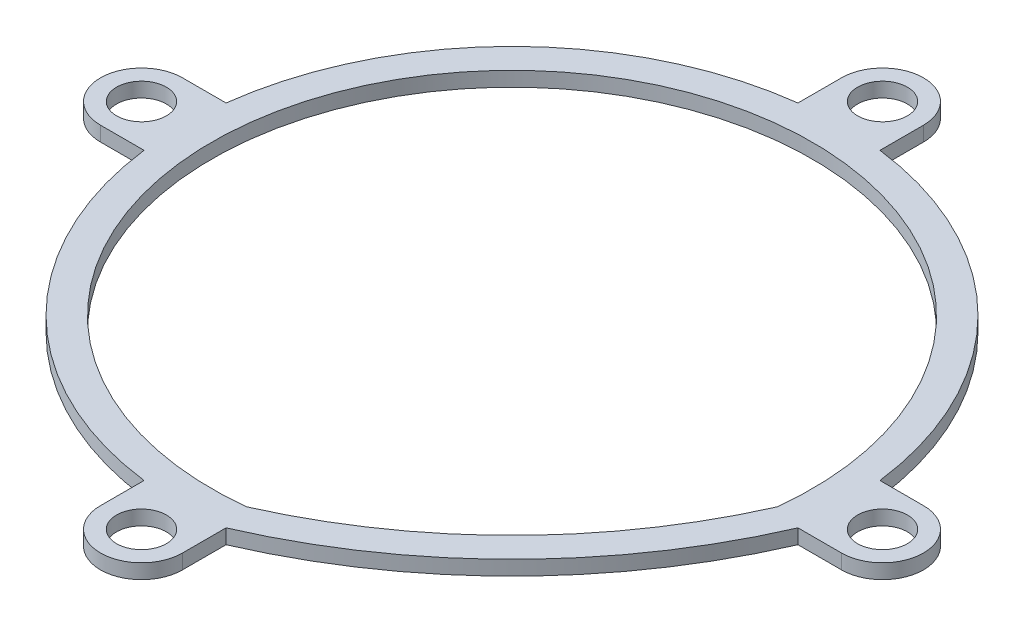
ISO-10303-21;
HEADER;
FILE_DESCRIPTION(('STEP AP214'),'2;1');
FILE_NAME('part.step','',(''),(''),'','','');
FILE_SCHEMA(('AUTOMOTIVE_DESIGN { 1 0 10303 214 1 1 1 1 }'));
ENDSEC;
DATA;
#1=APPLICATION_CONTEXT('core data for automotive mechanical design processes');
#2=APPLICATION_PROTOCOL_DEFINITION('international standard','automotive_design',2000,#1);
#3=PRODUCT_CONTEXT('',#1,'mechanical');
#4=PRODUCT('Part','Part','',(#3));
#5=PRODUCT_RELATED_PRODUCT_CATEGORY('part','',(#4));
#6=PRODUCT_DEFINITION_FORMATION('','',#4);
#7=PRODUCT_DEFINITION_CONTEXT('part definition',#1,'design');
#8=PRODUCT_DEFINITION('design','',#6,#7);
#9=PRODUCT_DEFINITION_SHAPE('','',#8);
#10=(LENGTH_UNIT() NAMED_UNIT(*) SI_UNIT(.MILLI.,.METRE.));
#11=(NAMED_UNIT(*) PLANE_ANGLE_UNIT() SI_UNIT($,.RADIAN.));
#12=(NAMED_UNIT(*) SI_UNIT($,.STERADIAN.) SOLID_ANGLE_UNIT());
#13=UNCERTAINTY_MEASURE_WITH_UNIT(LENGTH_MEASURE(1.E-05),#10,'distance_accuracy_value','');
#14=(GEOMETRIC_REPRESENTATION_CONTEXT(3) GLOBAL_UNCERTAINTY_ASSIGNED_CONTEXT((#13)) GLOBAL_UNIT_ASSIGNED_CONTEXT((#10,
#11,#12)) REPRESENTATION_CONTEXT('',''));
#15=CARTESIAN_POINT('',(0.,0.,0.));
#16=DIRECTION('',(0.,0.,1.));
#17=DIRECTION('',(1.,0.,0.));
#18=AXIS2_PLACEMENT_3D('',#15,#16,#17);
#19=CARTESIAN_POINT('',(-12.1017663344302,1.,-12.10176633443));
#20=DIRECTION('',(0.,1.,0.));
#21=DIRECTION('',(0.,0.,1.));
#22=AXIS2_PLACEMENT_3D('',#19,#20,#21);
#23=PLANE('',#22);
#24=CARTESIAN_POINT('',(-25.3,1.,0.));
#25=DIRECTION('',(0.,1.,0.));
#26=DIRECTION('',(0.,0.,1.));
#27=AXIS2_PLACEMENT_3D('',#24,#25,#26);
#28=CIRCLE('',#27,1.7);
#29=CARTESIAN_POINT('',(-25.3,1.,1.70000000000009));
#30=VERTEX_POINT('',#29);
#31=EDGE_CURVE('E583',#30,#30,#28,.T.);
#32=ORIENTED_EDGE('',*,*,#31,.F.);
#33=EDGE_LOOP('',(#32));
#34=FACE_BOUND('',#33,.T.);
#35=CARTESIAN_POINT('',(0.,1.,-25.3));
#36=DIRECTION('',(0.,1.,0.));
#37=DIRECTION('',(0.,0.,1.));
#38=AXIS2_PLACEMENT_3D('',#35,#36,#37);
#39=CIRCLE('',#38,1.7);
#40=CARTESIAN_POINT('',(0.,1.,-23.6));
#41=VERTEX_POINT('',#40);
#42=EDGE_CURVE('E585',#41,#41,#39,.T.);
#43=ORIENTED_EDGE('',*,*,#42,.F.);
#44=EDGE_LOOP('',(#43));
#45=FACE_BOUND('',#44,.T.);
#46=CARTESIAN_POINT('',(25.3,1.,-2.65412691824451E-13));
#47=DIRECTION('',(0.,1.,0.));
#48=DIRECTION('',(0.,0.,1.));
#49=AXIS2_PLACEMENT_3D('',#46,#47,#48);
#50=CIRCLE('',#49,1.7);
#51=CARTESIAN_POINT('',(25.3,1.,1.69999999999973));
#52=VERTEX_POINT('',#51);
#53=EDGE_CURVE('E593',#52,#52,#50,.T.);
#54=ORIENTED_EDGE('',*,*,#53,.F.);
#55=EDGE_LOOP('',(#54));
#56=FACE_BOUND('',#55,.T.);
#57=CARTESIAN_POINT('',(1.80411241501588E-13,1.,25.3));
#58=DIRECTION('',(0.,1.,0.));
#59=DIRECTION('',(0.,0.,1.));
#60=AXIS2_PLACEMENT_3D('',#57,#58,#59);
#61=CIRCLE('',#60,1.7);
#62=CARTESIAN_POINT('',(1.80411241501588E-13,1.,27.));
#63=VERTEX_POINT('',#62);
#64=EDGE_CURVE('E598',#63,#63,#61,.T.);
#65=ORIENTED_EDGE('',*,*,#64,.F.);
#66=EDGE_LOOP('',(#65));
#67=FACE_BOUND('',#66,.T.);
#68=CARTESIAN_POINT('',(-12.1017663344302,1.,-12.10176633443));
#69=DIRECTION('',(0.,1.,0.));
#70=DIRECTION('',(0.,0.,1.));
#71=AXIS2_PLACEMENT_3D('',#68,#69,#70);
#72=CIRCLE('',#71,37.513619216132);
#73=CARTESIAN_POINT('',(2.80000000000016,1.,22.3250979841075));
#74=VERTEX_POINT('',#73);
#75=CARTESIAN_POINT('',(22.3250979841075,1.,2.79999999999975));
#76=VERTEX_POINT('',#75);
#77=EDGE_CURVE('E180',#74,#76,#72,.T.);
#78=ORIENTED_EDGE('',*,*,#77,.T.);
#79=DIRECTION('',(1.,0.,0.));
#80=VECTOR('',#79,1.);
#81=CARTESIAN_POINT('',(22.3250979841075,1.,2.79999999999975));
#82=LINE('',#81,#80);
#83=CARTESIAN_POINT('',(25.3,1.,2.79999999999973));
#84=VERTEX_POINT('',#83);
#85=EDGE_CURVE('E183',#76,#84,#82,.T.);
#86=ORIENTED_EDGE('',*,*,#85,.T.);
#87=CARTESIAN_POINT('',(25.3,1.,-2.65412691824451E-13));
#88=DIRECTION('',(0.,1.,0.));
#89=DIRECTION('',(0.,0.,1.));
#90=AXIS2_PLACEMENT_3D('',#87,#88,#89);
#91=CIRCLE('',#90,2.8);
#92=CARTESIAN_POINT('',(25.3,1.,-2.80000000000026));
#93=VERTEX_POINT('',#92);
#94=EDGE_CURVE('E186',#84,#93,#91,.T.);
#95=ORIENTED_EDGE('',*,*,#94,.T.);
#96=DIRECTION('',(-1.,0.,0.));
#97=VECTOR('',#96,1.);
#98=CARTESIAN_POINT('',(25.3,1.,-2.80000000000026));
#99=LINE('',#98,#97);
#100=CARTESIAN_POINT('',(22.3250979841075,1.,-2.80000000000023));
#101=VERTEX_POINT('',#100);
#102=EDGE_CURVE('E188',#93,#101,#99,.T.);
#103=ORIENTED_EDGE('',*,*,#102,.T.);
#104=CARTESIAN_POINT('',(0.,1.,0.));
#105=DIRECTION('',(0.,1.,0.));
#106=DIRECTION('',(0.,0.,1.));
#107=AXIS2_PLACEMENT_3D('',#104,#105,#106);
#108=CIRCLE('',#107,22.5);
#109=CARTESIAN_POINT('',(2.8,1.,-22.3250979841075));
#110=VERTEX_POINT('',#109);
#111=EDGE_CURVE('E190',#101,#110,#108,.T.);
#112=ORIENTED_EDGE('',*,*,#111,.T.);
#113=DIRECTION('',(0.,0.,-1.));
#114=VECTOR('',#113,1.);
#115=CARTESIAN_POINT('',(2.8,1.,-22.3250979841075));
#116=LINE('',#115,#114);
#117=CARTESIAN_POINT('',(2.8,1.,-25.3));
#118=VERTEX_POINT('',#117);
#119=EDGE_CURVE('E192',#110,#118,#116,.T.);
#120=ORIENTED_EDGE('',*,*,#119,.T.);
#121=CARTESIAN_POINT('',(0.,1.,-25.3));
#122=DIRECTION('',(0.,1.,0.));
#123=DIRECTION('',(0.,0.,1.));
#124=AXIS2_PLACEMENT_3D('',#121,#122,#123);
#125=CIRCLE('',#124,2.8);
#126=CARTESIAN_POINT('',(-2.8,1.,-25.3));
#127=VERTEX_POINT('',#126);
#128=EDGE_CURVE('E194',#118,#127,#125,.T.);
#129=ORIENTED_EDGE('',*,*,#128,.T.);
#130=DIRECTION('',(0.,0.,1.));
#131=VECTOR('',#130,1.);
#132=CARTESIAN_POINT('',(-2.8,1.,-25.3));
#133=LINE('',#132,#131);
#134=CARTESIAN_POINT('',(-2.79999999999999,1.,-22.3250979841075));
#135=VERTEX_POINT('',#134);
#136=EDGE_CURVE('E196',#127,#135,#133,.T.);
#137=ORIENTED_EDGE('',*,*,#136,.T.);
#138=CARTESIAN_POINT('',(0.,1.,0.));
#139=DIRECTION('',(0.,1.,0.));
#140=DIRECTION('',(0.,0.,1.));
#141=AXIS2_PLACEMENT_3D('',#138,#139,#140);
#142=CIRCLE('',#141,22.5);
#143=CARTESIAN_POINT('',(-22.3250979841075,1.,-2.79999999999993));
#144=VERTEX_POINT('',#143);
#145=EDGE_CURVE('E198',#135,#144,#142,.T.);
#146=ORIENTED_EDGE('',*,*,#145,.T.);
#147=DIRECTION('',(-1.,0.,0.));
#148=VECTOR('',#147,1.);
#149=CARTESIAN_POINT('',(-22.3250979841075,1.,-2.79999999999993));
#150=LINE('',#149,#148);
#151=CARTESIAN_POINT('',(-25.3,1.,-2.79999999999991));
#152=VERTEX_POINT('',#151);
#153=EDGE_CURVE('E200',#144,#152,#150,.T.);
#154=ORIENTED_EDGE('',*,*,#153,.T.);
#155=CARTESIAN_POINT('',(-25.3,1.,0.));
#156=DIRECTION('',(0.,1.,0.));
#157=DIRECTION('',(0.,0.,1.));
#158=AXIS2_PLACEMENT_3D('',#155,#156,#157);
#159=CIRCLE('',#158,2.8);
#160=CARTESIAN_POINT('',(-25.3,1.,2.80000000000008));
#161=VERTEX_POINT('',#160);
#162=EDGE_CURVE('E202',#152,#161,#159,.T.);
#163=ORIENTED_EDGE('',*,*,#162,.T.);
#164=DIRECTION('',(1.,0.,0.));
#165=VECTOR('',#164,1.);
#166=CARTESIAN_POINT('',(-25.3,1.,2.80000000000008));
#167=LINE('',#166,#165);
#168=CARTESIAN_POINT('',(-22.3250979841075,1.,2.80000000000007));
#169=VERTEX_POINT('',#168);
#170=EDGE_CURVE('E204',#161,#169,#167,.T.);
#171=ORIENTED_EDGE('',*,*,#170,.T.);
#172=CARTESIAN_POINT('',(0.,1.,0.));
#173=DIRECTION('',(0.,1.,0.));
#174=DIRECTION('',(0.,0.,1.));
#175=AXIS2_PLACEMENT_3D('',#172,#173,#174);
#176=CIRCLE('',#175,22.5);
#177=CARTESIAN_POINT('',(-2.79999999999984,1.,22.3250979841075));
#178=VERTEX_POINT('',#177);
#179=EDGE_CURVE('E206',#169,#178,#176,.T.);
#180=ORIENTED_EDGE('',*,*,#179,.T.);
#181=DIRECTION('',(0.,0.,1.));
#182=VECTOR('',#181,1.);
#183=CARTESIAN_POINT('',(-2.79999999999984,1.,22.3250979841075));
#184=LINE('',#183,#182);
#185=CARTESIAN_POINT('',(-2.79999999999982,1.,25.3));
#186=VERTEX_POINT('',#185);
#187=EDGE_CURVE('E208',#178,#186,#184,.T.);
#188=ORIENTED_EDGE('',*,*,#187,.T.);
#189=CARTESIAN_POINT('',(1.80411241501588E-13,1.,25.3));
#190=DIRECTION('',(0.,1.,0.));
#191=DIRECTION('',(0.,0.,1.));
#192=AXIS2_PLACEMENT_3D('',#189,#190,#191);
#193=CIRCLE('',#192,2.8);
#194=CARTESIAN_POINT('',(2.80000000000018,1.,25.3));
#195=VERTEX_POINT('',#194);
#196=EDGE_CURVE('E210',#186,#195,#193,.T.);
#197=ORIENTED_EDGE('',*,*,#196,.T.);
#198=DIRECTION('',(0.,0.,-1.));
#199=VECTOR('',#198,1.);
#200=CARTESIAN_POINT('',(2.80000000000018,1.,25.3));
#201=LINE('',#200,#199);
#202=EDGE_CURVE('E212',#195,#74,#201,.T.);
#203=ORIENTED_EDGE('',*,*,#202,.T.);
#204=EDGE_LOOP('',(#78,#86,#95,#103,#112,#120,#129,#137,#146,#154,#163,#171,#180,#188,#197,#203));
#205=FACE_BOUND('',#204,.T.);
#206=CARTESIAN_POINT('',(0.,1.,0.));
#207=DIRECTION('',(0.,1.,0.));
#208=DIRECTION('',(0.,0.,1.));
#209=AXIS2_PLACEMENT_3D('',#206,#207,#208);
#210=CIRCLE('',#209,20.5);
#211=CARTESIAN_POINT('',(20.373939602323,1.,2.26993063349802));
#212=VERTEX_POINT('',#211);
#213=CARTESIAN_POINT('',(2.26993063349836,1.,20.373939602323));
#214=VERTEX_POINT('',#213);
#215=EDGE_CURVE('E160',#212,#214,#210,.T.);
#216=ORIENTED_EDGE('',*,*,#215,.F.);
#217=CARTESIAN_POINT('',(-12.1017663344302,1.,-12.10176633443));
#218=DIRECTION('',(0.,1.,0.));
#219=DIRECTION('',(0.,0.,1.));
#220=AXIS2_PLACEMENT_3D('',#217,#218,#219);
#221=CIRCLE('',#220,35.513619216132);
#222=EDGE_CURVE('E166',#214,#212,#221,.T.);
#223=ORIENTED_EDGE('',*,*,#222,.F.);
#224=EDGE_LOOP('',(#216,#223));
#225=FACE_BOUND('',#224,.T.);
#226=ADVANCED_FACE('F36',(#34,#45,#56,#67,#205,#225),#23,.T.);
#227=CARTESIAN_POINT('',(-12.1017663344302,0.,-12.10176633443));
#228=DIRECTION('',(0.,1.,0.));
#229=DIRECTION('',(0.,0.,1.));
#230=AXIS2_PLACEMENT_3D('',#227,#228,#229);
#231=PLANE('',#230);
#232=CARTESIAN_POINT('',(-25.3,0.,0.));
#233=DIRECTION('',(0.,1.,0.));
#234=DIRECTION('',(0.,0.,1.));
#235=AXIS2_PLACEMENT_3D('',#232,#233,#234);
#236=CIRCLE('',#235,1.7);
#237=CARTESIAN_POINT('',(-25.3,0.,1.70000000000009));
#238=VERTEX_POINT('',#237);
#239=EDGE_CURVE('E581',#238,#238,#236,.T.);
#240=ORIENTED_EDGE('',*,*,#239,.T.);
#241=EDGE_LOOP('',(#240));
#242=FACE_BOUND('',#241,.T.);
#243=CARTESIAN_POINT('',(0.,0.,-25.3));
#244=DIRECTION('',(0.,1.,0.));
#245=DIRECTION('',(0.,0.,1.));
#246=AXIS2_PLACEMENT_3D('',#243,#244,#245);
#247=CIRCLE('',#246,1.7);
#248=CARTESIAN_POINT('',(0.,0.,-23.6));
#249=VERTEX_POINT('',#248);
#250=EDGE_CURVE('E590',#249,#249,#247,.T.);
#251=ORIENTED_EDGE('',*,*,#250,.T.);
#252=EDGE_LOOP('',(#251));
#253=FACE_BOUND('',#252,.T.);
#254=CARTESIAN_POINT('',(25.3,0.,-2.65412691824451E-13));
#255=DIRECTION('',(0.,1.,0.));
#256=DIRECTION('',(0.,0.,1.));
#257=AXIS2_PLACEMENT_3D('',#254,#255,#256);
#258=CIRCLE('',#257,1.7);
#259=CARTESIAN_POINT('',(25.3,0.,1.69999999999973));
#260=VERTEX_POINT('',#259);
#261=EDGE_CURVE('E596',#260,#260,#258,.T.);
#262=ORIENTED_EDGE('',*,*,#261,.T.);
#263=EDGE_LOOP('',(#262));
#264=FACE_BOUND('',#263,.T.);
#265=CARTESIAN_POINT('',(1.80411241501588E-13,0.,25.3));
#266=DIRECTION('',(0.,1.,0.));
#267=DIRECTION('',(0.,0.,1.));
#268=AXIS2_PLACEMENT_3D('',#265,#266,#267);
#269=CIRCLE('',#268,1.7);
#270=CARTESIAN_POINT('',(1.80411241501588E-13,0.,27.));
#271=VERTEX_POINT('',#270);
#272=EDGE_CURVE('E174',#271,#271,#269,.T.);
#273=ORIENTED_EDGE('',*,*,#272,.T.);
#274=EDGE_LOOP('',(#273));
#275=FACE_BOUND('',#274,.T.);
#276=CARTESIAN_POINT('',(-12.1017663344302,0.,-12.10176633443));
#277=DIRECTION('',(0.,1.,0.));
#278=DIRECTION('',(0.,0.,1.));
#279=AXIS2_PLACEMENT_3D('',#276,#277,#278);
#280=CIRCLE('',#279,37.513619216132);
#281=CARTESIAN_POINT('',(2.80000000000016,0.,22.3250979841075));
#282=VERTEX_POINT('',#281);
#283=CARTESIAN_POINT('',(22.3250979841075,0.,2.79999999999975));
#284=VERTEX_POINT('',#283);
#285=EDGE_CURVE('E179',#282,#284,#280,.T.);
#286=ORIENTED_EDGE('',*,*,#285,.F.);
#287=DIRECTION('',(0.,0.,-1.));
#288=VECTOR('',#287,1.);
#289=CARTESIAN_POINT('',(2.80000000000018,0.,25.3));
#290=LINE('',#289,#288);
#291=CARTESIAN_POINT('',(2.80000000000018,0.,25.3));
#292=VERTEX_POINT('',#291);
#293=EDGE_CURVE('E184',#292,#282,#290,.T.);
#294=ORIENTED_EDGE('',*,*,#293,.F.);
#295=CARTESIAN_POINT('',(1.80411241501588E-13,0.,25.3));
#296=DIRECTION('',(0.,1.,0.));
#297=DIRECTION('',(0.,0.,1.));
#298=AXIS2_PLACEMENT_3D('',#295,#296,#297);
#299=CIRCLE('',#298,2.8);
#300=CARTESIAN_POINT('',(-2.79999999999982,0.,25.3));
#301=VERTEX_POINT('',#300);
#302=EDGE_CURVE('E243',#301,#292,#299,.T.);
#303=ORIENTED_EDGE('',*,*,#302,.F.);
#304=DIRECTION('',(0.,0.,1.));
#305=VECTOR('',#304,1.);
#306=CARTESIAN_POINT('',(-2.79999999999984,0.,22.3250979841075));
#307=LINE('',#306,#305);
#308=CARTESIAN_POINT('',(-2.79999999999984,0.,22.3250979841075));
#309=VERTEX_POINT('',#308);
#310=EDGE_CURVE('E241',#309,#301,#307,.T.);
#311=ORIENTED_EDGE('',*,*,#310,.F.);
#312=CARTESIAN_POINT('',(0.,0.,0.));
#313=DIRECTION('',(0.,1.,0.));
#314=DIRECTION('',(0.,0.,1.));
#315=AXIS2_PLACEMENT_3D('',#312,#313,#314);
#316=CIRCLE('',#315,22.5);
#317=CARTESIAN_POINT('',(-22.3250979841075,0.,2.80000000000007));
#318=VERTEX_POINT('',#317);
#319=EDGE_CURVE('E239',#318,#309,#316,.T.);
#320=ORIENTED_EDGE('',*,*,#319,.F.);
#321=DIRECTION('',(1.,0.,0.));
#322=VECTOR('',#321,1.);
#323=CARTESIAN_POINT('',(-25.3,0.,2.80000000000008));
#324=LINE('',#323,#322);
#325=CARTESIAN_POINT('',(-25.3,0.,2.80000000000008));
#326=VERTEX_POINT('',#325);
#327=EDGE_CURVE('E237',#326,#318,#324,.T.);
#328=ORIENTED_EDGE('',*,*,#327,.F.);
#329=CARTESIAN_POINT('',(-25.3,0.,0.));
#330=DIRECTION('',(0.,1.,0.));
#331=DIRECTION('',(0.,0.,1.));
#332=AXIS2_PLACEMENT_3D('',#329,#330,#331);
#333=CIRCLE('',#332,2.8);
#334=CARTESIAN_POINT('',(-25.3,0.,-2.79999999999991));
#335=VERTEX_POINT('',#334);
#336=EDGE_CURVE('E235',#335,#326,#333,.T.);
#337=ORIENTED_EDGE('',*,*,#336,.F.);
#338=DIRECTION('',(-1.,0.,0.));
#339=VECTOR('',#338,1.);
#340=CARTESIAN_POINT('',(-22.3250979841075,0.,-2.79999999999993));
#341=LINE('',#340,#339);
#342=CARTESIAN_POINT('',(-22.3250979841075,0.,-2.79999999999993));
#343=VERTEX_POINT('',#342);
#344=EDGE_CURVE('E233',#343,#335,#341,.T.);
#345=ORIENTED_EDGE('',*,*,#344,.F.);
#346=CARTESIAN_POINT('',(0.,0.,0.));
#347=DIRECTION('',(0.,1.,0.));
#348=DIRECTION('',(0.,0.,1.));
#349=AXIS2_PLACEMENT_3D('',#346,#347,#348);
#350=CIRCLE('',#349,22.5);
#351=CARTESIAN_POINT('',(-2.79999999999999,0.,-22.3250979841075));
#352=VERTEX_POINT('',#351);
#353=EDGE_CURVE('E231',#352,#343,#350,.T.);
#354=ORIENTED_EDGE('',*,*,#353,.F.);
#355=DIRECTION('',(0.,0.,1.));
#356=VECTOR('',#355,1.);
#357=CARTESIAN_POINT('',(-2.8,0.,-25.3));
#358=LINE('',#357,#356);
#359=CARTESIAN_POINT('',(-2.8,0.,-25.3));
#360=VERTEX_POINT('',#359);
#361=EDGE_CURVE('E229',#360,#352,#358,.T.);
#362=ORIENTED_EDGE('',*,*,#361,.F.);
#363=CARTESIAN_POINT('',(0.,0.,-25.3));
#364=DIRECTION('',(0.,1.,0.));
#365=DIRECTION('',(0.,0.,1.));
#366=AXIS2_PLACEMENT_3D('',#363,#364,#365);
#367=CIRCLE('',#366,2.8);
#368=CARTESIAN_POINT('',(2.8,0.,-25.3));
#369=VERTEX_POINT('',#368);
#370=EDGE_CURVE('E227',#369,#360,#367,.T.);
#371=ORIENTED_EDGE('',*,*,#370,.F.);
#372=DIRECTION('',(0.,0.,-1.));
#373=VECTOR('',#372,1.);
#374=CARTESIAN_POINT('',(2.8,0.,-22.3250979841075));
#375=LINE('',#374,#373);
#376=CARTESIAN_POINT('',(2.8,0.,-22.3250979841075));
#377=VERTEX_POINT('',#376);
#378=EDGE_CURVE('E225',#377,#369,#375,.T.);
#379=ORIENTED_EDGE('',*,*,#378,.F.);
#380=CARTESIAN_POINT('',(0.,0.,0.));
#381=DIRECTION('',(0.,1.,0.));
#382=DIRECTION('',(0.,0.,1.));
#383=AXIS2_PLACEMENT_3D('',#380,#381,#382);
#384=CIRCLE('',#383,22.5);
#385=CARTESIAN_POINT('',(22.3250979841075,0.,-2.80000000000023));
#386=VERTEX_POINT('',#385);
#387=EDGE_CURVE('E223',#386,#377,#384,.T.);
#388=ORIENTED_EDGE('',*,*,#387,.F.);
#389=DIRECTION('',(-1.,0.,0.));
#390=VECTOR('',#389,1.);
#391=CARTESIAN_POINT('',(25.3,0.,-2.80000000000026));
#392=LINE('',#391,#390);
#393=CARTESIAN_POINT('',(25.3,0.,-2.80000000000026));
#394=VERTEX_POINT('',#393);
#395=EDGE_CURVE('E221',#394,#386,#392,.T.);
#396=ORIENTED_EDGE('',*,*,#395,.F.);
#397=CARTESIAN_POINT('',(25.3,0.,-2.65412691824451E-13));
#398=DIRECTION('',(0.,1.,0.));
#399=DIRECTION('',(0.,0.,1.));
#400=AXIS2_PLACEMENT_3D('',#397,#398,#399);
#401=CIRCLE('',#400,2.8);
#402=CARTESIAN_POINT('',(25.3,0.,2.79999999999973));
#403=VERTEX_POINT('',#402);
#404=EDGE_CURVE('E219',#403,#394,#401,.T.);
#405=ORIENTED_EDGE('',*,*,#404,.F.);
#406=DIRECTION('',(1.,0.,0.));
#407=VECTOR('',#406,1.);
#408=CARTESIAN_POINT('',(22.3250979841075,0.,2.79999999999975));
#409=LINE('',#408,#407);
#410=EDGE_CURVE('E217',#284,#403,#409,.T.);
#411=ORIENTED_EDGE('',*,*,#410,.F.);
#412=EDGE_LOOP('',(#286,#294,#303,#311,#320,#328,#337,#345,#354,#362,#371,#379,#388,#396,#405,#411));
#413=FACE_BOUND('',#412,.T.);
#414=CARTESIAN_POINT('',(-12.1017663344302,0.,-12.10176633443));
#415=DIRECTION('',(0.,1.,0.));
#416=DIRECTION('',(0.,0.,1.));
#417=AXIS2_PLACEMENT_3D('',#414,#415,#416);
#418=CIRCLE('',#417,35.513619216132);
#419=CARTESIAN_POINT('',(2.26993063349836,0.,20.373939602323));
#420=VERTEX_POINT('',#419);
#421=CARTESIAN_POINT('',(20.373939602323,0.,2.26993063349802));
#422=VERTEX_POINT('',#421);
#423=EDGE_CURVE('E58',#420,#422,#418,.T.);
#424=ORIENTED_EDGE('',*,*,#423,.T.);
#425=CARTESIAN_POINT('',(0.,0.,0.));
#426=DIRECTION('',(0.,1.,0.));
#427=DIRECTION('',(0.,0.,1.));
#428=AXIS2_PLACEMENT_3D('',#425,#426,#427);
#429=CIRCLE('',#428,20.5);
#430=EDGE_CURVE('E170',#422,#420,#429,.T.);
#431=ORIENTED_EDGE('',*,*,#430,.T.);
#432=EDGE_LOOP('',(#424,#431));
#433=FACE_BOUND('',#432,.T.);
#434=ADVANCED_FACE('F297',(#242,#253,#264,#275,#413,#433),#231,.F.);
#435=CARTESIAN_POINT('',(-12.1017663344302,1.,-12.10176633443));
#436=DIRECTION('',(0.,-1.,0.));
#437=DIRECTION('',(0.,0.,-1.));
#438=AXIS2_PLACEMENT_3D('',#435,#436,#437);
#439=CYLINDRICAL_SURFACE('',#438,37.513619216132);
#440=ORIENTED_EDGE('',*,*,#285,.T.);
#441=DIRECTION('',(0.,-1.,0.));
#442=VECTOR('',#441,1.);
#443=CARTESIAN_POINT('',(22.3250979841075,1.,2.79999999999975));
#444=LINE('',#443,#442);
#445=EDGE_CURVE('E11',#76,#284,#444,.T.);
#446=ORIENTED_EDGE('',*,*,#445,.F.);
#447=ORIENTED_EDGE('',*,*,#77,.F.);
#448=DIRECTION('',(0.,-1.,0.));
#449=VECTOR('',#448,1.);
#450=CARTESIAN_POINT('',(2.80000000000016,1.,22.3250979841075));
#451=LINE('',#450,#449);
#452=EDGE_CURVE('E214',#74,#282,#451,.T.);
#453=ORIENTED_EDGE('',*,*,#452,.T.);
#454=EDGE_LOOP('',(#440,#446,#447,#453));
#455=FACE_BOUND('',#454,.T.);
#456=ADVANCED_FACE('F38',(#455),#439,.T.);
#457=CARTESIAN_POINT('',(22.3250979841075,1.,2.79999999999975));
#458=DIRECTION('',(0.,0.,-1.));
#459=DIRECTION('',(-1.,0.,0.));
#460=AXIS2_PLACEMENT_3D('',#457,#458,#459);
#461=PLANE('',#460);
#462=ORIENTED_EDGE('',*,*,#410,.T.);
#463=DIRECTION('',(0.,-1.,0.));
#464=VECTOR('',#463,1.);
#465=CARTESIAN_POINT('',(25.3,1.,2.79999999999973));
#466=LINE('',#465,#464);
#467=EDGE_CURVE('E44',#84,#403,#466,.T.);
#468=ORIENTED_EDGE('',*,*,#467,.F.);
#469=ORIENTED_EDGE('',*,*,#85,.F.);
#470=ORIENTED_EDGE('',*,*,#445,.T.);
#471=EDGE_LOOP('',(#462,#468,#469,#470));
#472=FACE_BOUND('',#471,.T.);
#473=ADVANCED_FACE('F314',(#472),#461,.F.);
#474=CARTESIAN_POINT('',(25.3,1.,-2.65412691824451E-13));
#475=DIRECTION('',(0.,-1.,0.));
#476=DIRECTION('',(0.,0.,-1.));
#477=AXIS2_PLACEMENT_3D('',#474,#475,#476);
#478=CYLINDRICAL_SURFACE('',#477,2.8);
#479=ORIENTED_EDGE('',*,*,#404,.T.);
#480=DIRECTION('',(0.,-1.,0.));
#481=VECTOR('',#480,1.);
#482=CARTESIAN_POINT('',(25.3,1.,-2.80000000000026));
#483=LINE('',#482,#481);
#484=EDGE_CURVE('E284',#93,#394,#483,.T.);
#485=ORIENTED_EDGE('',*,*,#484,.F.);
#486=ORIENTED_EDGE('',*,*,#94,.F.);
#487=ORIENTED_EDGE('',*,*,#467,.T.);
#488=EDGE_LOOP('',(#479,#485,#486,#487));
#489=FACE_BOUND('',#488,.T.);
#490=ADVANCED_FACE('F291',(#489),#478,.T.);
#491=CARTESIAN_POINT('',(25.3,1.,-2.80000000000026));
#492=DIRECTION('',(0.,0.,1.));
#493=DIRECTION('',(1.,0.,0.));
#494=AXIS2_PLACEMENT_3D('',#491,#492,#493);
#495=PLANE('',#494);
#496=ORIENTED_EDGE('',*,*,#395,.T.);
#497=DIRECTION('',(0.,-1.,0.));
#498=VECTOR('',#497,1.);
#499=CARTESIAN_POINT('',(22.3250979841075,1.,-2.80000000000023));
#500=LINE('',#499,#498);
#501=EDGE_CURVE('E281',#101,#386,#500,.T.);
#502=ORIENTED_EDGE('',*,*,#501,.F.);
#503=ORIENTED_EDGE('',*,*,#102,.F.);
#504=ORIENTED_EDGE('',*,*,#484,.T.);
#505=EDGE_LOOP('',(#496,#502,#503,#504));
#506=FACE_BOUND('',#505,.T.);
#507=ADVANCED_FACE('F303',(#506),#495,.F.);
#508=CARTESIAN_POINT('',(0.,1.,0.));
#509=DIRECTION('',(0.,-1.,0.));
#510=DIRECTION('',(0.,0.,-1.));
#511=AXIS2_PLACEMENT_3D('',#508,#509,#510);
#512=CYLINDRICAL_SURFACE('',#511,22.5);
#513=ORIENTED_EDGE('',*,*,#387,.T.);
#514=DIRECTION('',(0.,-1.,0.));
#515=VECTOR('',#514,1.);
#516=CARTESIAN_POINT('',(2.8,1.,-22.3250979841075));
#517=LINE('',#516,#515);
#518=EDGE_CURVE('E278',#110,#377,#517,.T.);
#519=ORIENTED_EDGE('',*,*,#518,.F.);
#520=ORIENTED_EDGE('',*,*,#111,.F.);
#521=ORIENTED_EDGE('',*,*,#501,.T.);
#522=EDGE_LOOP('',(#513,#519,#520,#521));
#523=FACE_BOUND('',#522,.T.);
#524=ADVANCED_FACE('F307',(#523),#512,.T.);
#525=CARTESIAN_POINT('',(2.8,1.,-22.3250979841075));
#526=DIRECTION('',(-1.,0.,0.));
#527=DIRECTION('',(0.,0.,1.));
#528=AXIS2_PLACEMENT_3D('',#525,#526,#527);
#529=PLANE('',#528);
#530=ORIENTED_EDGE('',*,*,#378,.T.);
#531=DIRECTION('',(0.,-1.,0.));
#532=VECTOR('',#531,1.);
#533=CARTESIAN_POINT('',(2.8,1.,-25.3));
#534=LINE('',#533,#532);
#535=EDGE_CURVE('E275',#118,#369,#534,.T.);
#536=ORIENTED_EDGE('',*,*,#535,.F.);
#537=ORIENTED_EDGE('',*,*,#119,.F.);
#538=ORIENTED_EDGE('',*,*,#518,.T.);
#539=EDGE_LOOP('',(#530,#536,#537,#538));
#540=FACE_BOUND('',#539,.T.);
#541=ADVANCED_FACE('F367',(#540),#529,.F.);
#542=CARTESIAN_POINT('',(0.,1.,-25.3));
#543=DIRECTION('',(0.,-1.,0.));
#544=DIRECTION('',(0.,0.,-1.));
#545=AXIS2_PLACEMENT_3D('',#542,#543,#544);
#546=CYLINDRICAL_SURFACE('',#545,2.8);
#547=ORIENTED_EDGE('',*,*,#370,.T.);
#548=DIRECTION('',(0.,-1.,0.));
#549=VECTOR('',#548,1.);
#550=CARTESIAN_POINT('',(-2.8,1.,-25.3));
#551=LINE('',#550,#549);
#552=EDGE_CURVE('E272',#127,#360,#551,.T.);
#553=ORIENTED_EDGE('',*,*,#552,.F.);
#554=ORIENTED_EDGE('',*,*,#128,.F.);
#555=ORIENTED_EDGE('',*,*,#535,.T.);
#556=EDGE_LOOP('',(#547,#553,#554,#555));
#557=FACE_BOUND('',#556,.T.);
#558=ADVANCED_FACE('F364',(#557),#546,.T.);
#559=CARTESIAN_POINT('',(-2.8,1.,-25.3));
#560=DIRECTION('',(1.,0.,0.));
#561=DIRECTION('',(0.,0.,-1.));
#562=AXIS2_PLACEMENT_3D('',#559,#560,#561);
#563=PLANE('',#562);
#564=ORIENTED_EDGE('',*,*,#361,.T.);
#565=DIRECTION('',(0.,-1.,0.));
#566=VECTOR('',#565,1.);
#567=CARTESIAN_POINT('',(-2.79999999999999,1.,-22.3250979841075));
#568=LINE('',#567,#566);
#569=EDGE_CURVE('E269',#135,#352,#568,.T.);
#570=ORIENTED_EDGE('',*,*,#569,.F.);
#571=ORIENTED_EDGE('',*,*,#136,.F.);
#572=ORIENTED_EDGE('',*,*,#552,.T.);
#573=EDGE_LOOP('',(#564,#570,#571,#572));
#574=FACE_BOUND('',#573,.T.);
#575=ADVANCED_FACE('F360',(#574),#563,.F.);
#576=CARTESIAN_POINT('',(0.,1.,0.));
#577=DIRECTION('',(0.,-1.,0.));
#578=DIRECTION('',(0.,0.,-1.));
#579=AXIS2_PLACEMENT_3D('',#576,#577,#578);
#580=CYLINDRICAL_SURFACE('',#579,22.5);
#581=ORIENTED_EDGE('',*,*,#353,.T.);
#582=DIRECTION('',(0.,-1.,0.));
#583=VECTOR('',#582,1.);
#584=CARTESIAN_POINT('',(-22.3250979841075,1.,-2.79999999999993));
#585=LINE('',#584,#583);
#586=EDGE_CURVE('E266',#144,#343,#585,.T.);
#587=ORIENTED_EDGE('',*,*,#586,.F.);
#588=ORIENTED_EDGE('',*,*,#145,.F.);
#589=ORIENTED_EDGE('',*,*,#569,.T.);
#590=EDGE_LOOP('',(#581,#587,#588,#589));
#591=FACE_BOUND('',#590,.T.);
#592=ADVANCED_FACE('F356',(#591),#580,.T.);
#593=CARTESIAN_POINT('',(-22.3250979841075,1.,-2.79999999999993));
#594=DIRECTION('',(0.,0.,1.));
#595=DIRECTION('',(1.,0.,0.));
#596=AXIS2_PLACEMENT_3D('',#593,#594,#595);
#597=PLANE('',#596);
#598=ORIENTED_EDGE('',*,*,#344,.T.);
#599=DIRECTION('',(0.,-1.,0.));
#600=VECTOR('',#599,1.);
#601=CARTESIAN_POINT('',(-25.3,1.,-2.79999999999991));
#602=LINE('',#601,#600);
#603=EDGE_CURVE('E263',#152,#335,#602,.T.);
#604=ORIENTED_EDGE('',*,*,#603,.F.);
#605=ORIENTED_EDGE('',*,*,#153,.F.);
#606=ORIENTED_EDGE('',*,*,#586,.T.);
#607=EDGE_LOOP('',(#598,#604,#605,#606));
#608=FACE_BOUND('',#607,.T.);
#609=ADVANCED_FACE('F351',(#608),#597,.F.);
#610=CARTESIAN_POINT('',(-25.3,1.,0.));
#611=DIRECTION('',(0.,-1.,0.));
#612=DIRECTION('',(0.,0.,-1.));
#613=AXIS2_PLACEMENT_3D('',#610,#611,#612);
#614=CYLINDRICAL_SURFACE('',#613,2.8);
#615=ORIENTED_EDGE('',*,*,#336,.T.);
#616=DIRECTION('',(0.,-1.,0.));
#617=VECTOR('',#616,1.);
#618=CARTESIAN_POINT('',(-25.3,1.,2.80000000000008));
#619=LINE('',#618,#617);
#620=EDGE_CURVE('E260',#161,#326,#619,.T.);
#621=ORIENTED_EDGE('',*,*,#620,.F.);
#622=ORIENTED_EDGE('',*,*,#162,.F.);
#623=ORIENTED_EDGE('',*,*,#603,.T.);
#624=EDGE_LOOP('',(#615,#621,#622,#623));
#625=FACE_BOUND('',#624,.T.);
#626=ADVANCED_FACE('F345',(#625),#614,.T.);
#627=CARTESIAN_POINT('',(-25.3,1.,2.80000000000008));
#628=DIRECTION('',(0.,0.,-1.));
#629=DIRECTION('',(-1.,0.,0.));
#630=AXIS2_PLACEMENT_3D('',#627,#628,#629);
#631=PLANE('',#630);
#632=ORIENTED_EDGE('',*,*,#327,.T.);
#633=DIRECTION('',(0.,-1.,0.));
#634=VECTOR('',#633,1.);
#635=CARTESIAN_POINT('',(-22.3250979841075,1.,2.80000000000007));
#636=LINE('',#635,#634);
#637=EDGE_CURVE('E257',#169,#318,#636,.T.);
#638=ORIENTED_EDGE('',*,*,#637,.F.);
#639=ORIENTED_EDGE('',*,*,#170,.F.);
#640=ORIENTED_EDGE('',*,*,#620,.T.);
#641=EDGE_LOOP('',(#632,#638,#639,#640));
#642=FACE_BOUND('',#641,.T.);
#643=ADVANCED_FACE('F341',(#642),#631,.F.);
#644=CARTESIAN_POINT('',(0.,1.,0.));
#645=DIRECTION('',(0.,-1.,0.));
#646=DIRECTION('',(0.,0.,-1.));
#647=AXIS2_PLACEMENT_3D('',#644,#645,#646);
#648=CYLINDRICAL_SURFACE('',#647,22.5);
#649=ORIENTED_EDGE('',*,*,#319,.T.);
#650=DIRECTION('',(0.,-1.,0.));
#651=VECTOR('',#650,1.);
#652=CARTESIAN_POINT('',(-2.79999999999984,1.,22.3250979841075));
#653=LINE('',#652,#651);
#654=EDGE_CURVE('E254',#178,#309,#653,.T.);
#655=ORIENTED_EDGE('',*,*,#654,.F.);
#656=ORIENTED_EDGE('',*,*,#179,.F.);
#657=ORIENTED_EDGE('',*,*,#637,.T.);
#658=EDGE_LOOP('',(#649,#655,#656,#657));
#659=FACE_BOUND('',#658,.T.);
#660=ADVANCED_FACE('F336',(#659),#648,.T.);
#661=CARTESIAN_POINT('',(-2.79999999999984,1.,22.3250979841075));
#662=DIRECTION('',(1.,0.,0.));
#663=DIRECTION('',(0.,0.,-1.));
#664=AXIS2_PLACEMENT_3D('',#661,#662,#663);
#665=PLANE('',#664);
#666=ORIENTED_EDGE('',*,*,#310,.T.);
#667=DIRECTION('',(0.,-1.,0.));
#668=VECTOR('',#667,1.);
#669=CARTESIAN_POINT('',(-2.79999999999982,1.,25.3));
#670=LINE('',#669,#668);
#671=EDGE_CURVE('E251',#186,#301,#670,.T.);
#672=ORIENTED_EDGE('',*,*,#671,.F.);
#673=ORIENTED_EDGE('',*,*,#187,.F.);
#674=ORIENTED_EDGE('',*,*,#654,.T.);
#675=EDGE_LOOP('',(#666,#672,#673,#674));
#676=FACE_BOUND('',#675,.T.);
#677=ADVANCED_FACE('F330',(#676),#665,.F.);
#678=CARTESIAN_POINT('',(1.80411241501588E-13,1.,25.3));
#679=DIRECTION('',(0.,-1.,0.));
#680=DIRECTION('',(0.,0.,-1.));
#681=AXIS2_PLACEMENT_3D('',#678,#679,#680);
#682=CYLINDRICAL_SURFACE('',#681,2.8);
#683=ORIENTED_EDGE('',*,*,#302,.T.);
#684=DIRECTION('',(0.,-1.,0.));
#685=VECTOR('',#684,1.);
#686=CARTESIAN_POINT('',(2.80000000000018,1.,25.3));
#687=LINE('',#686,#685);
#688=EDGE_CURVE('E248',#195,#292,#687,.T.);
#689=ORIENTED_EDGE('',*,*,#688,.F.);
#690=ORIENTED_EDGE('',*,*,#196,.F.);
#691=ORIENTED_EDGE('',*,*,#671,.T.);
#692=EDGE_LOOP('',(#683,#689,#690,#691));
#693=FACE_BOUND('',#692,.T.);
#694=ADVANCED_FACE('F326',(#693),#682,.T.);
#695=CARTESIAN_POINT('',(2.80000000000018,1.,25.3));
#696=DIRECTION('',(-1.,0.,0.));
#697=DIRECTION('',(0.,0.,1.));
#698=AXIS2_PLACEMENT_3D('',#695,#696,#697);
#699=PLANE('',#698);
#700=ORIENTED_EDGE('',*,*,#293,.T.);
#701=ORIENTED_EDGE('',*,*,#452,.F.);
#702=ORIENTED_EDGE('',*,*,#202,.F.);
#703=ORIENTED_EDGE('',*,*,#688,.T.);
#704=EDGE_LOOP('',(#700,#701,#702,#703));
#705=FACE_BOUND('',#704,.T.);
#706=ADVANCED_FACE('F321',(#705),#699,.F.);
#707=CARTESIAN_POINT('',(-12.1017663344302,1.,-12.10176633443));
#708=DIRECTION('',(0.,-1.,0.));
#709=DIRECTION('',(0.,0.,-1.));
#710=AXIS2_PLACEMENT_3D('',#707,#708,#709);
#711=CYLINDRICAL_SURFACE('',#710,35.513619216132);
#712=ORIENTED_EDGE('',*,*,#423,.F.);
#713=DIRECTION('',(0.,-1.,0.));
#714=VECTOR('',#713,1.);
#715=CARTESIAN_POINT('',(2.26993063349836,1.,20.373939602323));
#716=LINE('',#715,#714);
#717=EDGE_CURVE('E162',#214,#420,#716,.T.);
#718=ORIENTED_EDGE('',*,*,#717,.F.);
#719=ORIENTED_EDGE('',*,*,#222,.T.);
#720=DIRECTION('',(0.,-1.,0.));
#721=VECTOR('',#720,1.);
#722=CARTESIAN_POINT('',(20.373939602323,1.,2.26993063349802));
#723=LINE('',#722,#721);
#724=EDGE_CURVE('E51',#212,#422,#723,.T.);
#725=ORIENTED_EDGE('',*,*,#724,.T.);
#726=EDGE_LOOP('',(#712,#718,#719,#725));
#727=FACE_BOUND('',#726,.T.);
#728=ADVANCED_FACE('F168',(#727),#711,.F.);
#729=CARTESIAN_POINT('',(0.,1.,0.));
#730=DIRECTION('',(0.,-1.,0.));
#731=DIRECTION('',(0.,0.,-1.));
#732=AXIS2_PLACEMENT_3D('',#729,#730,#731);
#733=CYLINDRICAL_SURFACE('',#732,20.5);
#734=ORIENTED_EDGE('',*,*,#430,.F.);
#735=ORIENTED_EDGE('',*,*,#724,.F.);
#736=ORIENTED_EDGE('',*,*,#215,.T.);
#737=ORIENTED_EDGE('',*,*,#717,.T.);
#738=EDGE_LOOP('',(#734,#735,#736,#737));
#739=FACE_BOUND('',#738,.T.);
#740=ADVANCED_FACE('F161',(#739),#733,.F.);
#741=CARTESIAN_POINT('',(1.80411241501588E-13,1.,25.3));
#742=DIRECTION('',(0.,1.,0.));
#743=DIRECTION('',(0.,0.,1.));
#744=AXIS2_PLACEMENT_3D('',#741,#742,#743);
#745=CYLINDRICAL_SURFACE('',#744,1.7);
#746=ORIENTED_EDGE('',*,*,#272,.F.);
#747=EDGE_LOOP('',(#746));
#748=FACE_BOUND('',#747,.T.);
#749=ORIENTED_EDGE('',*,*,#64,.T.);
#750=EDGE_LOOP('',(#749));
#751=FACE_BOUND('',#750,.T.);
#752=ADVANCED_FACE('F453',(#748,#751),#745,.F.);
#753=CARTESIAN_POINT('',(25.3,1.,-2.65412691824451E-13));
#754=DIRECTION('',(0.,1.,0.));
#755=DIRECTION('',(0.,0.,1.));
#756=AXIS2_PLACEMENT_3D('',#753,#754,#755);
#757=CYLINDRICAL_SURFACE('',#756,1.7);
#758=ORIENTED_EDGE('',*,*,#261,.F.);
#759=EDGE_LOOP('',(#758));
#760=FACE_BOUND('',#759,.T.);
#761=ORIENTED_EDGE('',*,*,#53,.T.);
#762=EDGE_LOOP('',(#761));
#763=FACE_BOUND('',#762,.T.);
#764=ADVANCED_FACE('F459',(#760,#763),#757,.F.);
#765=CARTESIAN_POINT('',(0.,1.,-25.3));
#766=DIRECTION('',(0.,1.,0.));
#767=DIRECTION('',(0.,0.,1.));
#768=AXIS2_PLACEMENT_3D('',#765,#766,#767);
#769=CYLINDRICAL_SURFACE('',#768,1.7);
#770=ORIENTED_EDGE('',*,*,#250,.F.);
#771=EDGE_LOOP('',(#770));
#772=FACE_BOUND('',#771,.T.);
#773=ORIENTED_EDGE('',*,*,#42,.T.);
#774=EDGE_LOOP('',(#773));
#775=FACE_BOUND('',#774,.T.);
#776=ADVANCED_FACE('F467',(#772,#775),#769,.F.);
#777=CARTESIAN_POINT('',(-25.3,1.,0.));
#778=DIRECTION('',(0.,1.,0.));
#779=DIRECTION('',(0.,0.,1.));
#780=AXIS2_PLACEMENT_3D('',#777,#778,#779);
#781=CYLINDRICAL_SURFACE('',#780,1.7);
#782=ORIENTED_EDGE('',*,*,#239,.F.);
#783=EDGE_LOOP('',(#782));
#784=FACE_BOUND('',#783,.T.);
#785=ORIENTED_EDGE('',*,*,#31,.T.);
#786=EDGE_LOOP('',(#785));
#787=FACE_BOUND('',#786,.T.);
#788=ADVANCED_FACE('F475',(#784,#787),#781,.F.);
#789=CLOSED_SHELL('',(#226,#434,#456,#473,#490,#507,#524,#541,#558,#575,#592,#609,#626,#643,
#660,#677,#694,#706,#728,#740,#752,#764,#776,#788));
#790=MANIFOLD_SOLID_BREP('B2',#789);
#791=ADVANCED_BREP_SHAPE_REPRESENTATION('',(#18,#790),#14);
#792=SHAPE_DEFINITION_REPRESENTATION(#9,#791);
ENDSEC;
END-ISO-10303-21;
